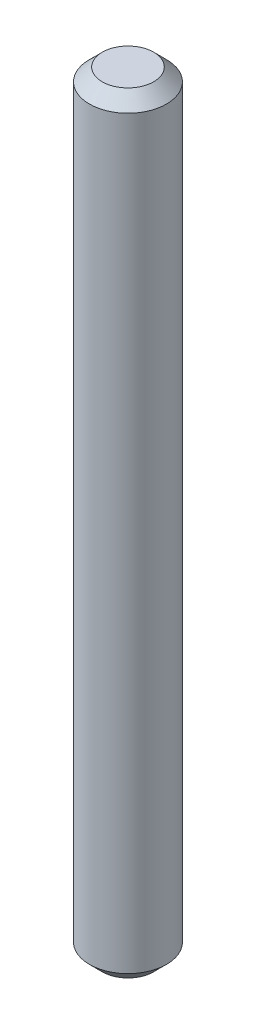
ISO-10303-21;
HEADER;
FILE_DESCRIPTION(('STEP AP214'),'2;1');
FILE_NAME('part.step','',(''),(''),'','','');
FILE_SCHEMA(('AUTOMOTIVE_DESIGN { 1 0 10303 214 1 1 1 1 }'));
ENDSEC;
DATA;
#1=APPLICATION_CONTEXT('core data for automotive mechanical design processes');
#2=APPLICATION_PROTOCOL_DEFINITION('international standard','automotive_design',2000,#1);
#3=PRODUCT_CONTEXT('',#1,'mechanical');
#4=PRODUCT('Part','Part','',(#3));
#5=PRODUCT_RELATED_PRODUCT_CATEGORY('part','',(#4));
#6=PRODUCT_DEFINITION_FORMATION('','',#4);
#7=PRODUCT_DEFINITION_CONTEXT('part definition',#1,'design');
#8=PRODUCT_DEFINITION('design','',#6,#7);
#9=PRODUCT_DEFINITION_SHAPE('','',#8);
#10=(LENGTH_UNIT() NAMED_UNIT(*) SI_UNIT(.MILLI.,.METRE.));
#11=(NAMED_UNIT(*) PLANE_ANGLE_UNIT() SI_UNIT($,.RADIAN.));
#12=(NAMED_UNIT(*) SI_UNIT($,.STERADIAN.) SOLID_ANGLE_UNIT());
#13=UNCERTAINTY_MEASURE_WITH_UNIT(LENGTH_MEASURE(1.E-05),#10,'distance_accuracy_value','');
#14=(GEOMETRIC_REPRESENTATION_CONTEXT(3) GLOBAL_UNCERTAINTY_ASSIGNED_CONTEXT((#13)) GLOBAL_UNIT_ASSIGNED_CONTEXT((#10,
#11,#12)) REPRESENTATION_CONTEXT('',''));
#15=CARTESIAN_POINT('',(0.,0.,0.));
#16=DIRECTION('',(0.,0.,1.));
#17=DIRECTION('',(1.,0.,0.));
#18=AXIS2_PLACEMENT_3D('',#15,#16,#17);
#19=CARTESIAN_POINT('',(0.,30.,0.));
#20=DIRECTION('',(0.,-1.,0.));
#21=DIRECTION('',(0.,0.,-1.));
#22=AXIS2_PLACEMENT_3D('',#19,#20,#21);
#23=CYLINDRICAL_SURFACE('',#22,1.5);
#24=CARTESIAN_POINT('',(0.,0.499999999999997,0.));
#25=DIRECTION('',(0.,1.,0.));
#26=DIRECTION('',(0.,0.,1.));
#27=AXIS2_PLACEMENT_3D('',#24,#25,#26);
#28=CIRCLE('',#27,1.5);
#29=CARTESIAN_POINT('',(0.,0.499999999999997,1.5));
#30=VERTEX_POINT('',#29);
#31=EDGE_CURVE('E47',#30,#30,#28,.T.);
#32=ORIENTED_EDGE('',*,*,#31,.T.);
#33=EDGE_LOOP('',(#32));
#34=FACE_BOUND('',#33,.T.);
#35=CARTESIAN_POINT('',(0.,29.5,0.));
#36=DIRECTION('',(0.,1.,0.));
#37=DIRECTION('',(0.,0.,1.));
#38=AXIS2_PLACEMENT_3D('',#35,#36,#37);
#39=CIRCLE('',#38,1.5);
#40=CARTESIAN_POINT('',(0.,29.5,1.5));
#41=VERTEX_POINT('',#40);
#42=EDGE_CURVE('E51',#41,#41,#39,.F.);
#43=ORIENTED_EDGE('',*,*,#42,.T.);
#44=EDGE_LOOP('',(#43));
#45=FACE_BOUND('',#44,.T.);
#46=ADVANCED_FACE('F35',(#34,#45),#23,.T.);
#47=CARTESIAN_POINT('',(0.,30.,0.));
#48=DIRECTION('',(0.,1.,0.));
#49=DIRECTION('',(0.,0.,1.));
#50=AXIS2_PLACEMENT_3D('',#47,#48,#49);
#51=PLANE('',#50);
#52=CARTESIAN_POINT('',(0.,30.,0.));
#53=DIRECTION('',(0.,1.,0.));
#54=DIRECTION('',(0.,0.,1.));
#55=AXIS2_PLACEMENT_3D('',#52,#53,#54);
#56=CIRCLE('',#55,1.);
#57=CARTESIAN_POINT('',(0.,30.,1.));
#58=VERTEX_POINT('',#57);
#59=EDGE_CURVE('E10',#58,#58,#56,.T.);
#60=ORIENTED_EDGE('',*,*,#59,.T.);
#61=EDGE_LOOP('',(#60));
#62=FACE_BOUND('',#61,.T.);
#63=ADVANCED_FACE('F67',(#62),#51,.T.);
#64=CARTESIAN_POINT('',(0.,0.,0.));
#65=DIRECTION('',(0.,1.,0.));
#66=DIRECTION('',(0.,0.,1.));
#67=AXIS2_PLACEMENT_3D('',#64,#65,#66);
#68=PLANE('',#67);
#69=CARTESIAN_POINT('',(0.,0.,0.));
#70=DIRECTION('',(0.,1.,0.));
#71=DIRECTION('',(0.,0.,1.));
#72=AXIS2_PLACEMENT_3D('',#69,#70,#71);
#73=CIRCLE('',#72,1.);
#74=CARTESIAN_POINT('',(0.,0.,1.));
#75=VERTEX_POINT('',#74);
#76=EDGE_CURVE('E43',#75,#75,#73,.F.);
#77=ORIENTED_EDGE('',*,*,#76,.T.);
#78=EDGE_LOOP('',(#77));
#79=FACE_BOUND('',#78,.T.);
#80=ADVANCED_FACE('F64',(#79),#68,.F.);
#81=CARTESIAN_POINT('',(0.,0.499999999999997,0.));
#82=DIRECTION('',(0.,1.,0.));
#83=DIRECTION('',(0.,0.,1.));
#84=AXIS2_PLACEMENT_3D('',#81,#82,#83);
#85=CONICAL_SURFACE('',#84,1.5,0.78539816339745);
#86=ORIENTED_EDGE('',*,*,#76,.F.);
#87=EDGE_LOOP('',(#86));
#88=FACE_BOUND('',#87,.T.);
#89=ORIENTED_EDGE('',*,*,#31,.F.);
#90=EDGE_LOOP('',(#89));
#91=FACE_BOUND('',#90,.T.);
#92=ADVANCED_FACE('F60',(#88,#91),#85,.T.);
#93=CARTESIAN_POINT('',(0.,30.,0.));
#94=DIRECTION('',(0.,-1.,0.));
#95=DIRECTION('',(0.,0.,-1.));
#96=AXIS2_PLACEMENT_3D('',#93,#94,#95);
#97=CONICAL_SURFACE('',#96,1.,0.78539816339745);
#98=ORIENTED_EDGE('',*,*,#42,.F.);
#99=EDGE_LOOP('',(#98));
#100=FACE_BOUND('',#99,.T.);
#101=ORIENTED_EDGE('',*,*,#59,.F.);
#102=EDGE_LOOP('',(#101));
#103=FACE_BOUND('',#102,.T.);
#104=ADVANCED_FACE('F38',(#100,#103),#97,.T.);
#105=CLOSED_SHELL('',(#46,#63,#80,#92,#104));
#106=MANIFOLD_SOLID_BREP('B2',#105);
#107=ADVANCED_BREP_SHAPE_REPRESENTATION('',(#18,#106),#14);
#108=SHAPE_DEFINITION_REPRESENTATION(#9,#107);
ENDSEC;
END-ISO-10303-21;
